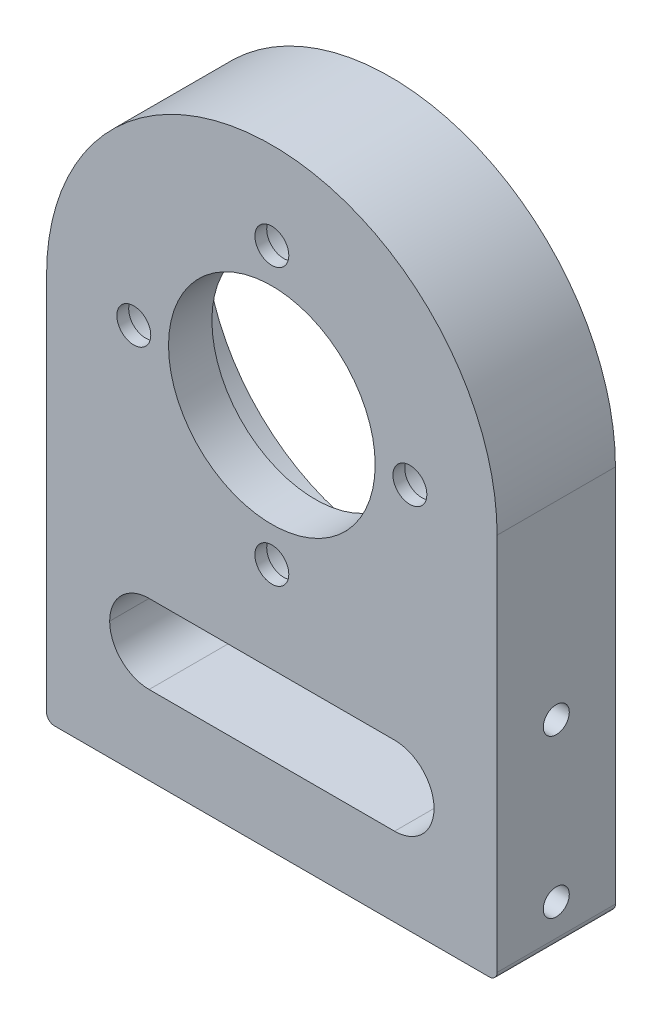
ISO-10303-21;
HEADER;
FILE_DESCRIPTION(('STEP AP214'),'2;1');
FILE_NAME('part.step','',(''),(''),'','','');
FILE_SCHEMA(('AUTOMOTIVE_DESIGN { 1 0 10303 214 1 1 1 1 }'));
ENDSEC;
DATA;
#1=APPLICATION_CONTEXT('core data for automotive mechanical design processes');
#2=APPLICATION_PROTOCOL_DEFINITION('international standard','automotive_design',2000,#1);
#3=PRODUCT_CONTEXT('',#1,'mechanical');
#4=PRODUCT('Part','Part','',(#3));
#5=PRODUCT_RELATED_PRODUCT_CATEGORY('part','',(#4));
#6=PRODUCT_DEFINITION_FORMATION('','',#4);
#7=PRODUCT_DEFINITION_CONTEXT('part definition',#1,'design');
#8=PRODUCT_DEFINITION('design','',#6,#7);
#9=PRODUCT_DEFINITION_SHAPE('','',#8);
#10=(LENGTH_UNIT() NAMED_UNIT(*) SI_UNIT(.MILLI.,.METRE.));
#11=(NAMED_UNIT(*) PLANE_ANGLE_UNIT() SI_UNIT($,.RADIAN.));
#12=(NAMED_UNIT(*) SI_UNIT($,.STERADIAN.) SOLID_ANGLE_UNIT());
#13=UNCERTAINTY_MEASURE_WITH_UNIT(LENGTH_MEASURE(1.E-05),#10,'distance_accuracy_value','');
#14=(GEOMETRIC_REPRESENTATION_CONTEXT(3) GLOBAL_UNCERTAINTY_ASSIGNED_CONTEXT((#13)) GLOBAL_UNIT_ASSIGNED_CONTEXT((#10,
#11,#12)) REPRESENTATION_CONTEXT('',''));
#15=CARTESIAN_POINT('',(0.,0.,0.));
#16=DIRECTION('',(0.,0.,1.));
#17=DIRECTION('',(1.,0.,0.));
#18=AXIS2_PLACEMENT_3D('',#15,#16,#17);
#19=CARTESIAN_POINT('',(0.,38.,15.));
#20=DIRECTION('',(0.,0.,1.));
#21=DIRECTION('',(1.,0.,0.));
#22=AXIS2_PLACEMENT_3D('',#19,#20,#21);
#23=PLANE('',#22);
#24=CARTESIAN_POINT('',(15.56,4.,15.));
#25=DIRECTION('',(0.,0.,1.));
#26=DIRECTION('',(1.,0.,0.));
#27=AXIS2_PLACEMENT_3D('',#24,#25,#26);
#28=CIRCLE('',#27,5.);
#29=CARTESIAN_POINT('',(15.56,8.99999999999999,15.));
#30=VERTEX_POINT('',#29);
#31=CARTESIAN_POINT('',(20.56,4.,15.));
#32=VERTEX_POINT('',#31);
#33=EDGE_CURVE('E58',#30,#32,#28,.F.);
#34=ORIENTED_EDGE('',*,*,#33,.T.);
#35=CARTESIAN_POINT('',(15.56,3.99999999999999,15.));
#36=DIRECTION('',(0.,0.,1.));
#37=DIRECTION('',(1.,0.,0.));
#38=AXIS2_PLACEMENT_3D('',#35,#36,#37);
#39=CIRCLE('',#38,5.);
#40=CARTESIAN_POINT('',(15.56,-1.00000000000001,15.));
#41=VERTEX_POINT('',#40);
#42=EDGE_CURVE('E11',#32,#41,#39,.F.);
#43=ORIENTED_EDGE('',*,*,#42,.T.);
#44=DIRECTION('',(-1.,0.,0.));
#45=VECTOR('',#44,1.);
#46=CARTESIAN_POINT('',(-20.56,-1.,15.));
#47=LINE('',#46,#45);
#48=CARTESIAN_POINT('',(-15.56,-1.,15.));
#49=VERTEX_POINT('',#48);
#50=EDGE_CURVE('E382',#41,#49,#47,.T.);
#51=ORIENTED_EDGE('',*,*,#50,.T.);
#52=CARTESIAN_POINT('',(-15.56,4.,15.));
#53=DIRECTION('',(0.,0.,1.));
#54=DIRECTION('',(1.,0.,0.));
#55=AXIS2_PLACEMENT_3D('',#52,#53,#54);
#56=CIRCLE('',#55,5.);
#57=CARTESIAN_POINT('',(-20.56,4.,15.));
#58=VERTEX_POINT('',#57);
#59=EDGE_CURVE('E353',#49,#58,#56,.F.);
#60=ORIENTED_EDGE('',*,*,#59,.T.);
#61=CARTESIAN_POINT('',(-15.56,4.,15.));
#62=DIRECTION('',(0.,0.,1.));
#63=DIRECTION('',(1.,0.,0.));
#64=AXIS2_PLACEMENT_3D('',#61,#62,#63);
#65=CIRCLE('',#64,5.);
#66=CARTESIAN_POINT('',(-15.56,9.,15.));
#67=VERTEX_POINT('',#66);
#68=EDGE_CURVE('E347',#58,#67,#65,.F.);
#69=ORIENTED_EDGE('',*,*,#68,.T.);
#70=DIRECTION('',(1.,0.,0.));
#71=VECTOR('',#70,1.);
#72=CARTESIAN_POINT('',(-20.56,9.,15.));
#73=LINE('',#72,#71);
#74=EDGE_CURVE('E163',#67,#30,#73,.T.);
#75=ORIENTED_EDGE('',*,*,#74,.T.);
#76=EDGE_LOOP('',(#34,#43,#51,#60,#69,#75));
#77=FACE_BOUND('',#76,.T.);
#78=CARTESIAN_POINT('',(0.,20.5,15.));
#79=DIRECTION('',(0.,0.,1.));
#80=DIRECTION('',(1.,0.,0.));
#81=AXIS2_PLACEMENT_3D('',#78,#79,#80);
#82=CIRCLE('',#81,2.15);
#83=CARTESIAN_POINT('',(2.15000000000003,20.5,15.));
#84=VERTEX_POINT('',#83);
#85=EDGE_CURVE('E261',#84,#84,#82,.T.);
#86=ORIENTED_EDGE('',*,*,#85,.F.);
#87=EDGE_LOOP('',(#86));
#88=FACE_BOUND('',#87,.T.);
#89=CARTESIAN_POINT('',(0.,55.5,15.));
#90=DIRECTION('',(0.,0.,1.));
#91=DIRECTION('',(1.,0.,0.));
#92=AXIS2_PLACEMENT_3D('',#89,#90,#91);
#93=CIRCLE('',#92,2.15);
#94=CARTESIAN_POINT('',(2.15000000000002,55.5,15.));
#95=VERTEX_POINT('',#94);
#96=EDGE_CURVE('E269',#95,#95,#93,.T.);
#97=ORIENTED_EDGE('',*,*,#96,.F.);
#98=EDGE_LOOP('',(#97));
#99=FACE_BOUND('',#98,.T.);
#100=CARTESIAN_POINT('',(0.,38.,15.));
#101=DIRECTION('',(0.,0.,1.));
#102=DIRECTION('',(1.,0.,0.));
#103=AXIS2_PLACEMENT_3D('',#100,#101,#102);
#104=CIRCLE('',#103,13.1);
#105=CARTESIAN_POINT('',(13.1,38.,15.));
#106=VERTEX_POINT('',#105);
#107=EDGE_CURVE('E273',#106,#106,#104,.T.);
#108=ORIENTED_EDGE('',*,*,#107,.F.);
#109=EDGE_LOOP('',(#108));
#110=FACE_BOUND('',#109,.T.);
#111=CARTESIAN_POINT('',(17.5,38.,15.));
#112=DIRECTION('',(0.,0.,1.));
#113=DIRECTION('',(1.,0.,0.));
#114=AXIS2_PLACEMENT_3D('',#111,#112,#113);
#115=CIRCLE('',#114,2.15);
#116=CARTESIAN_POINT('',(19.65,38.,15.));
#117=VERTEX_POINT('',#116);
#118=EDGE_CURVE('E265',#117,#117,#115,.T.);
#119=ORIENTED_EDGE('',*,*,#118,.F.);
#120=EDGE_LOOP('',(#119));
#121=FACE_BOUND('',#120,.T.);
#122=CARTESIAN_POINT('',(-17.5,38.,15.));
#123=DIRECTION('',(0.,0.,1.));
#124=DIRECTION('',(1.,0.,0.));
#125=AXIS2_PLACEMENT_3D('',#122,#123,#124);
#126=CIRCLE('',#125,2.15000000000009);
#127=CARTESIAN_POINT('',(-15.3499999999999,38.,15.));
#128=VERTEX_POINT('',#127);
#129=EDGE_CURVE('E246',#128,#128,#126,.T.);
#130=ORIENTED_EDGE('',*,*,#129,.F.);
#131=EDGE_LOOP('',(#130));
#132=FACE_BOUND('',#131,.T.);
#133=DIRECTION('',(0.,1.,0.));
#134=VECTOR('',#133,1.);
#135=CARTESIAN_POINT('',(28.56,-11.,15.));
#136=LINE('',#135,#134);
#137=CARTESIAN_POINT('',(28.56,-10.,15.));
#138=VERTEX_POINT('',#137);
#139=CARTESIAN_POINT('',(28.56,38.,15.));
#140=VERTEX_POINT('',#139);
#141=EDGE_CURVE('E159',#138,#140,#136,.T.);
#142=ORIENTED_EDGE('',*,*,#141,.T.);
#143=CARTESIAN_POINT('',(0.,38.,15.));
#144=DIRECTION('',(0.,0.,-1.));
#145=DIRECTION('',(-1.,0.,0.));
#146=AXIS2_PLACEMENT_3D('',#143,#144,#145);
#147=CIRCLE('',#146,28.56);
#148=CARTESIAN_POINT('',(-28.56,38.,15.));
#149=VERTEX_POINT('',#148);
#150=EDGE_CURVE('E151',#149,#140,#147,.T.);
#151=ORIENTED_EDGE('',*,*,#150,.F.);
#152=DIRECTION('',(0.,-1.,0.));
#153=VECTOR('',#152,1.);
#154=CARTESIAN_POINT('',(-28.56,-11.,15.));
#155=LINE('',#154,#153);
#156=CARTESIAN_POINT('',(-28.56,-10.,15.));
#157=VERTEX_POINT('',#156);
#158=EDGE_CURVE('E132',#149,#157,#155,.T.);
#159=ORIENTED_EDGE('',*,*,#158,.T.);
#160=CARTESIAN_POINT('',(-27.56,-10.,15.));
#161=DIRECTION('',(0.,0.,1.));
#162=DIRECTION('',(1.,0.,0.));
#163=AXIS2_PLACEMENT_3D('',#160,#161,#162);
#164=CIRCLE('',#163,1.);
#165=CARTESIAN_POINT('',(-27.56,-11.,15.));
#166=VERTEX_POINT('',#165);
#167=EDGE_CURVE('E308',#157,#166,#164,.T.);
#168=ORIENTED_EDGE('',*,*,#167,.T.);
#169=DIRECTION('',(1.,0.,0.));
#170=VECTOR('',#169,1.);
#171=CARTESIAN_POINT('',(-28.56,-11.,15.));
#172=LINE('',#171,#170);
#173=CARTESIAN_POINT('',(27.56,-11.,15.));
#174=VERTEX_POINT('',#173);
#175=EDGE_CURVE('E144',#166,#174,#172,.T.);
#176=ORIENTED_EDGE('',*,*,#175,.T.);
#177=CARTESIAN_POINT('',(27.56,-10.,15.));
#178=DIRECTION('',(0.,0.,1.));
#179=DIRECTION('',(1.,0.,0.));
#180=AXIS2_PLACEMENT_3D('',#177,#178,#179);
#181=CIRCLE('',#180,1.);
#182=EDGE_CURVE('E311',#174,#138,#181,.T.);
#183=ORIENTED_EDGE('',*,*,#182,.T.);
#184=EDGE_LOOP('',(#142,#151,#159,#168,#176,#183));
#185=FACE_BOUND('',#184,.T.);
#186=ADVANCED_FACE('F41',(#77,#88,#99,#110,#121,#132,#185),#23,.T.);
#187=CARTESIAN_POINT('',(0.,38.,0.));
#188=DIRECTION('',(0.,0.,1.));
#189=DIRECTION('',(1.,0.,0.));
#190=AXIS2_PLACEMENT_3D('',#187,#188,#189);
#191=PLANE('',#190);
#192=DIRECTION('',(-1.,0.,0.));
#193=VECTOR('',#192,1.);
#194=CARTESIAN_POINT('',(-20.56,-1.,0.));
#195=LINE('',#194,#193);
#196=CARTESIAN_POINT('',(15.56,-1.00000000000001,0.));
#197=VERTEX_POINT('',#196);
#198=CARTESIAN_POINT('',(-15.56,-1.,0.));
#199=VERTEX_POINT('',#198);
#200=EDGE_CURVE('E365',#197,#199,#195,.T.);
#201=ORIENTED_EDGE('',*,*,#200,.F.);
#202=CARTESIAN_POINT('',(15.56,3.99999999999999,0.));
#203=DIRECTION('',(0.,0.,1.));
#204=DIRECTION('',(1.,0.,0.));
#205=AXIS2_PLACEMENT_3D('',#202,#203,#204);
#206=CIRCLE('',#205,5.);
#207=CARTESIAN_POINT('',(20.56,4.,0.));
#208=VERTEX_POINT('',#207);
#209=EDGE_CURVE('E51',#197,#208,#206,.T.);
#210=ORIENTED_EDGE('',*,*,#209,.T.);
#211=CARTESIAN_POINT('',(15.56,4.,0.));
#212=DIRECTION('',(0.,0.,1.));
#213=DIRECTION('',(1.,0.,0.));
#214=AXIS2_PLACEMENT_3D('',#211,#212,#213);
#215=CIRCLE('',#214,5.);
#216=CARTESIAN_POINT('',(15.56,8.99999999999999,0.));
#217=VERTEX_POINT('',#216);
#218=EDGE_CURVE('E356',#208,#217,#215,.T.);
#219=ORIENTED_EDGE('',*,*,#218,.T.);
#220=DIRECTION('',(1.,0.,0.));
#221=VECTOR('',#220,1.);
#222=CARTESIAN_POINT('',(-20.56,9.,0.));
#223=LINE('',#222,#221);
#224=CARTESIAN_POINT('',(-15.56,9.,0.));
#225=VERTEX_POINT('',#224);
#226=EDGE_CURVE('E166',#225,#217,#223,.T.);
#227=ORIENTED_EDGE('',*,*,#226,.F.);
#228=CARTESIAN_POINT('',(-15.56,4.,0.));
#229=DIRECTION('',(0.,0.,1.));
#230=DIRECTION('',(1.,0.,0.));
#231=AXIS2_PLACEMENT_3D('',#228,#229,#230);
#232=CIRCLE('',#231,5.);
#233=CARTESIAN_POINT('',(-20.56,4.,0.));
#234=VERTEX_POINT('',#233);
#235=EDGE_CURVE('E344',#225,#234,#232,.T.);
#236=ORIENTED_EDGE('',*,*,#235,.T.);
#237=CARTESIAN_POINT('',(-15.56,4.,0.));
#238=DIRECTION('',(0.,0.,1.));
#239=DIRECTION('',(1.,0.,0.));
#240=AXIS2_PLACEMENT_3D('',#237,#238,#239);
#241=CIRCLE('',#240,5.);
#242=EDGE_CURVE('E350',#234,#199,#241,.T.);
#243=ORIENTED_EDGE('',*,*,#242,.T.);
#244=EDGE_LOOP('',(#201,#210,#219,#227,#236,#243));
#245=FACE_BOUND('',#244,.T.);
#246=CARTESIAN_POINT('',(0.,38.,0.));
#247=DIRECTION('',(0.,0.,-1.));
#248=DIRECTION('',(-1.,0.,0.));
#249=AXIS2_PLACEMENT_3D('',#246,#247,#248);
#250=CIRCLE('',#249,23.5);
#251=CARTESIAN_POINT('',(-23.5,38.,0.));
#252=VERTEX_POINT('',#251);
#253=EDGE_CURVE('E217',#252,#252,#250,.T.);
#254=ORIENTED_EDGE('',*,*,#253,.F.);
#255=EDGE_LOOP('',(#254));
#256=FACE_BOUND('',#255,.T.);
#257=CARTESIAN_POINT('',(0.,38.,0.));
#258=DIRECTION('',(0.,0.,-1.));
#259=DIRECTION('',(-1.,0.,0.));
#260=AXIS2_PLACEMENT_3D('',#257,#258,#259);
#261=CIRCLE('',#260,28.56);
#262=CARTESIAN_POINT('',(-28.56,38.,0.));
#263=VERTEX_POINT('',#262);
#264=CARTESIAN_POINT('',(28.56,38.,0.));
#265=VERTEX_POINT('',#264);
#266=EDGE_CURVE('E154',#263,#265,#261,.T.);
#267=ORIENTED_EDGE('',*,*,#266,.T.);
#268=DIRECTION('',(0.,1.,0.));
#269=VECTOR('',#268,1.);
#270=CARTESIAN_POINT('',(28.56,-11.,0.));
#271=LINE('',#270,#269);
#272=CARTESIAN_POINT('',(28.56,-10.,0.));
#273=VERTEX_POINT('',#272);
#274=EDGE_CURVE('E145',#273,#265,#271,.T.);
#275=ORIENTED_EDGE('',*,*,#274,.F.);
#276=CARTESIAN_POINT('',(27.56,-10.,0.));
#277=DIRECTION('',(0.,0.,1.));
#278=DIRECTION('',(1.,0.,0.));
#279=AXIS2_PLACEMENT_3D('',#276,#277,#278);
#280=CIRCLE('',#279,1.);
#281=CARTESIAN_POINT('',(27.56,-11.,0.));
#282=VERTEX_POINT('',#281);
#283=EDGE_CURVE('E298',#273,#282,#280,.F.);
#284=ORIENTED_EDGE('',*,*,#283,.T.);
#285=DIRECTION('',(1.,0.,0.));
#286=VECTOR('',#285,1.);
#287=CARTESIAN_POINT('',(-28.56,-11.,0.));
#288=LINE('',#287,#286);
#289=CARTESIAN_POINT('',(-27.56,-11.,0.));
#290=VERTEX_POINT('',#289);
#291=EDGE_CURVE('E286',#290,#282,#288,.T.);
#292=ORIENTED_EDGE('',*,*,#291,.F.);
#293=CARTESIAN_POINT('',(-27.56,-10.,0.));
#294=DIRECTION('',(0.,0.,1.));
#295=DIRECTION('',(1.,0.,0.));
#296=AXIS2_PLACEMENT_3D('',#293,#294,#295);
#297=CIRCLE('',#296,1.);
#298=CARTESIAN_POINT('',(-28.56,-10.,0.));
#299=VERTEX_POINT('',#298);
#300=EDGE_CURVE('E295',#290,#299,#297,.F.);
#301=ORIENTED_EDGE('',*,*,#300,.T.);
#302=DIRECTION('',(0.,-1.,0.));
#303=VECTOR('',#302,1.);
#304=CARTESIAN_POINT('',(-28.56,-11.,0.));
#305=LINE('',#304,#303);
#306=EDGE_CURVE('E276',#263,#299,#305,.T.);
#307=ORIENTED_EDGE('',*,*,#306,.F.);
#308=EDGE_LOOP('',(#267,#275,#284,#292,#301,#307));
#309=FACE_BOUND('',#308,.T.);
#310=ADVANCED_FACE('F398',(#245,#256,#309),#191,.F.);
#311=CARTESIAN_POINT('',(0.,55.5,15.));
#312=DIRECTION('',(0.,0.,-1.));
#313=DIRECTION('',(-1.,0.,0.));
#314=AXIS2_PLACEMENT_3D('',#311,#312,#313);
#315=CYLINDRICAL_SURFACE('',#314,2.15);
#316=ORIENTED_EDGE('',*,*,#96,.T.);
#317=EDGE_LOOP('',(#316));
#318=FACE_BOUND('',#317,.T.);
#319=CARTESIAN_POINT('',(0.,55.5,13.5));
#320=DIRECTION('',(0.,0.,-1.));
#321=DIRECTION('',(-1.,0.,0.));
#322=AXIS2_PLACEMENT_3D('',#319,#320,#321);
#323=CIRCLE('',#322,2.15);
#324=CARTESIAN_POINT('',(-2.14999999999998,55.5,13.5));
#325=VERTEX_POINT('',#324);
#326=EDGE_CURVE('E213',#325,#325,#323,.T.);
#327=ORIENTED_EDGE('',*,*,#326,.T.);
#328=EDGE_LOOP('',(#327));
#329=FACE_BOUND('',#328,.T.);
#330=ADVANCED_FACE('F417',(#318,#329),#315,.F.);
#331=CARTESIAN_POINT('',(17.5,38.,15.));
#332=DIRECTION('',(0.,0.,-1.));
#333=DIRECTION('',(-1.,0.,0.));
#334=AXIS2_PLACEMENT_3D('',#331,#332,#333);
#335=CYLINDRICAL_SURFACE('',#334,2.15);
#336=ORIENTED_EDGE('',*,*,#118,.T.);
#337=EDGE_LOOP('',(#336));
#338=FACE_BOUND('',#337,.T.);
#339=CARTESIAN_POINT('',(17.5,38.,13.5));
#340=DIRECTION('',(0.,0.,-1.));
#341=DIRECTION('',(-1.,0.,0.));
#342=AXIS2_PLACEMENT_3D('',#339,#340,#341);
#343=CIRCLE('',#342,2.15);
#344=CARTESIAN_POINT('',(15.35,38.,13.5));
#345=VERTEX_POINT('',#344);
#346=EDGE_CURVE('E324',#345,#345,#343,.T.);
#347=ORIENTED_EDGE('',*,*,#346,.T.);
#348=EDGE_LOOP('',(#347));
#349=FACE_BOUND('',#348,.T.);
#350=ADVANCED_FACE('F505',(#338,#349),#335,.F.);
#351=CARTESIAN_POINT('',(0.,20.5,15.));
#352=DIRECTION('',(0.,0.,-1.));
#353=DIRECTION('',(-1.,0.,0.));
#354=AXIS2_PLACEMENT_3D('',#351,#352,#353);
#355=CYLINDRICAL_SURFACE('',#354,2.15);
#356=ORIENTED_EDGE('',*,*,#85,.T.);
#357=EDGE_LOOP('',(#356));
#358=FACE_BOUND('',#357,.T.);
#359=CARTESIAN_POINT('',(0.,20.5,13.5));
#360=DIRECTION('',(0.,0.,-1.));
#361=DIRECTION('',(-1.,0.,0.));
#362=AXIS2_PLACEMENT_3D('',#359,#360,#361);
#363=CIRCLE('',#362,2.15);
#364=CARTESIAN_POINT('',(-2.14999999999996,20.5,13.5));
#365=VERTEX_POINT('',#364);
#366=EDGE_CURVE('E320',#365,#365,#363,.T.);
#367=ORIENTED_EDGE('',*,*,#366,.T.);
#368=EDGE_LOOP('',(#367));
#369=FACE_BOUND('',#368,.T.);
#370=ADVANCED_FACE('F501',(#358,#369),#355,.F.);
#371=CARTESIAN_POINT('',(-17.5,38.,15.));
#372=DIRECTION('',(0.,0.,-1.));
#373=DIRECTION('',(-1.,0.,0.));
#374=AXIS2_PLACEMENT_3D('',#371,#372,#373);
#375=CYLINDRICAL_SURFACE('',#374,2.15000000000009);
#376=ORIENTED_EDGE('',*,*,#129,.T.);
#377=EDGE_LOOP('',(#376));
#378=FACE_BOUND('',#377,.T.);
#379=CARTESIAN_POINT('',(-17.5,38.,13.5));
#380=DIRECTION('',(0.,0.,-1.));
#381=DIRECTION('',(-1.,0.,0.));
#382=AXIS2_PLACEMENT_3D('',#379,#380,#381);
#383=CIRCLE('',#382,2.15000000000009);
#384=CARTESIAN_POINT('',(-19.6500000000001,38.,13.5));
#385=VERTEX_POINT('',#384);
#386=EDGE_CURVE('E176',#385,#385,#383,.T.);
#387=ORIENTED_EDGE('',*,*,#386,.T.);
#388=EDGE_LOOP('',(#387));
#389=FACE_BOUND('',#388,.T.);
#390=ADVANCED_FACE('F498',(#378,#389),#375,.F.);
#391=CARTESIAN_POINT('',(0.,38.,15.));
#392=DIRECTION('',(0.,0.,-1.));
#393=DIRECTION('',(-1.,0.,0.));
#394=AXIS2_PLACEMENT_3D('',#391,#392,#393);
#395=CYLINDRICAL_SURFACE('',#394,13.1);
#396=ORIENTED_EDGE('',*,*,#107,.T.);
#397=EDGE_LOOP('',(#396));
#398=FACE_BOUND('',#397,.T.);
#399=CARTESIAN_POINT('',(0.,38.,9.5));
#400=DIRECTION('',(0.,0.,-1.));
#401=DIRECTION('',(-1.,0.,0.));
#402=AXIS2_PLACEMENT_3D('',#399,#400,#401);
#403=CIRCLE('',#402,13.1);
#404=CARTESIAN_POINT('',(-13.1,38.,9.5));
#405=VERTEX_POINT('',#404);
#406=EDGE_CURVE('E208',#405,#405,#403,.T.);
#407=ORIENTED_EDGE('',*,*,#406,.T.);
#408=EDGE_LOOP('',(#407));
#409=FACE_BOUND('',#408,.T.);
#410=ADVANCED_FACE('F420',(#398,#409),#395,.F.);
#411=CARTESIAN_POINT('',(-28.56,-11.,15.));
#412=DIRECTION('',(1.,0.,0.));
#413=DIRECTION('',(0.,0.,-1.));
#414=AXIS2_PLACEMENT_3D('',#411,#412,#413);
#415=PLANE('',#414);
#416=CARTESIAN_POINT('',(-28.56,-5.99999999999999,7.5));
#417=DIRECTION('',(1.,0.,0.));
#418=DIRECTION('',(0.,0.,-1.));
#419=AXIS2_PLACEMENT_3D('',#416,#417,#418);
#420=CIRCLE('',#419,1.65);
#421=CARTESIAN_POINT('',(-28.56,-5.99999999999999,5.85));
#422=VERTEX_POINT('',#421);
#423=EDGE_CURVE('E231',#422,#422,#420,.T.);
#424=ORIENTED_EDGE('',*,*,#423,.T.);
#425=EDGE_LOOP('',(#424));
#426=FACE_BOUND('',#425,.T.);
#427=CARTESIAN_POINT('',(-28.56,14.,7.5));
#428=DIRECTION('',(1.,0.,0.));
#429=DIRECTION('',(0.,0.,-1.));
#430=AXIS2_PLACEMENT_3D('',#427,#428,#429);
#431=CIRCLE('',#430,1.65);
#432=CARTESIAN_POINT('',(-28.56,14.,5.85));
#433=VERTEX_POINT('',#432);
#434=EDGE_CURVE('E222',#433,#433,#431,.T.);
#435=ORIENTED_EDGE('',*,*,#434,.T.);
#436=EDGE_LOOP('',(#435));
#437=FACE_BOUND('',#436,.T.);
#438=ORIENTED_EDGE('',*,*,#306,.T.);
#439=DIRECTION('',(0.,0.,-1.));
#440=VECTOR('',#439,1.);
#441=CARTESIAN_POINT('',(-28.56,-10.,15.));
#442=LINE('',#441,#440);
#443=EDGE_CURVE('E139',#299,#157,#442,.F.);
#444=ORIENTED_EDGE('',*,*,#443,.T.);
#445=ORIENTED_EDGE('',*,*,#158,.F.);
#446=DIRECTION('',(0.,0.,-1.));
#447=VECTOR('',#446,1.);
#448=CARTESIAN_POINT('',(-28.56,38.,15.));
#449=LINE('',#448,#447);
#450=EDGE_CURVE('E136',#149,#263,#449,.T.);
#451=ORIENTED_EDGE('',*,*,#450,.T.);
#452=EDGE_LOOP('',(#438,#444,#445,#451));
#453=FACE_BOUND('',#452,.T.);
#454=ADVANCED_FACE('F135',(#426,#437,#453),#415,.F.);
#455=CARTESIAN_POINT('',(-28.56,-11.,15.));
#456=DIRECTION('',(0.,1.,0.));
#457=DIRECTION('',(0.,0.,1.));
#458=AXIS2_PLACEMENT_3D('',#455,#456,#457);
#459=PLANE('',#458);
#460=ORIENTED_EDGE('',*,*,#291,.T.);
#461=DIRECTION('',(0.,0.,-1.));
#462=VECTOR('',#461,1.);
#463=CARTESIAN_POINT('',(27.56,-11.,15.));
#464=LINE('',#463,#462);
#465=EDGE_CURVE('E305',#282,#174,#464,.F.);
#466=ORIENTED_EDGE('',*,*,#465,.T.);
#467=ORIENTED_EDGE('',*,*,#175,.F.);
#468=DIRECTION('',(0.,0.,-1.));
#469=VECTOR('',#468,1.);
#470=CARTESIAN_POINT('',(-27.56,-11.,15.));
#471=LINE('',#470,#469);
#472=EDGE_CURVE('E301',#166,#290,#471,.T.);
#473=ORIENTED_EDGE('',*,*,#472,.T.);
#474=EDGE_LOOP('',(#460,#466,#467,#473));
#475=FACE_BOUND('',#474,.T.);
#476=ADVANCED_FACE('F427',(#475),#459,.F.);
#477=CARTESIAN_POINT('',(28.56,-11.,15.));
#478=DIRECTION('',(-1.,0.,0.));
#479=DIRECTION('',(0.,-1.,0.));
#480=AXIS2_PLACEMENT_3D('',#477,#478,#479);
#481=PLANE('',#480);
#482=CARTESIAN_POINT('',(28.56,-5.99999999999999,7.5));
#483=DIRECTION('',(1.,0.,0.));
#484=DIRECTION('',(0.,0.,-1.));
#485=AXIS2_PLACEMENT_3D('',#482,#483,#484);
#486=CIRCLE('',#485,1.65);
#487=CARTESIAN_POINT('',(28.56,-5.99999999999999,5.85));
#488=VERTEX_POINT('',#487);
#489=EDGE_CURVE('E247',#488,#488,#486,.T.);
#490=ORIENTED_EDGE('',*,*,#489,.F.);
#491=EDGE_LOOP('',(#490));
#492=FACE_BOUND('',#491,.T.);
#493=CARTESIAN_POINT('',(28.56,14.,7.5));
#494=DIRECTION('',(1.,0.,0.));
#495=DIRECTION('',(0.,0.,-1.));
#496=AXIS2_PLACEMENT_3D('',#493,#494,#495);
#497=CIRCLE('',#496,1.65);
#498=CARTESIAN_POINT('',(28.56,14.,5.85));
#499=VERTEX_POINT('',#498);
#500=EDGE_CURVE('E230',#499,#499,#497,.T.);
#501=ORIENTED_EDGE('',*,*,#500,.F.);
#502=EDGE_LOOP('',(#501));
#503=FACE_BOUND('',#502,.T.);
#504=ORIENTED_EDGE('',*,*,#141,.F.);
#505=DIRECTION('',(0.,0.,-1.));
#506=VECTOR('',#505,1.);
#507=CARTESIAN_POINT('',(28.56,-10.,15.));
#508=LINE('',#507,#506);
#509=EDGE_CURVE('E283',#138,#273,#508,.T.);
#510=ORIENTED_EDGE('',*,*,#509,.T.);
#511=ORIENTED_EDGE('',*,*,#274,.T.);
#512=DIRECTION('',(0.,0.,-1.));
#513=VECTOR('',#512,1.);
#514=CARTESIAN_POINT('',(28.56,38.,15.));
#515=LINE('',#514,#513);
#516=EDGE_CURVE('E156',#140,#265,#515,.T.);
#517=ORIENTED_EDGE('',*,*,#516,.F.);
#518=EDGE_LOOP('',(#504,#510,#511,#517));
#519=FACE_BOUND('',#518,.T.);
#520=ADVANCED_FACE('F423',(#492,#503,#519),#481,.F.);
#521=CARTESIAN_POINT('',(18.56,14.,7.5));
#522=DIRECTION('',(1.,0.,0.));
#523=DIRECTION('',(0.,0.,-1.));
#524=AXIS2_PLACEMENT_3D('',#521,#522,#523);
#525=CYLINDRICAL_SURFACE('',#524,1.65);
#526=CARTESIAN_POINT('',(18.56,14.,7.5));
#527=DIRECTION('',(1.,0.,0.));
#528=DIRECTION('',(0.,0.,-1.));
#529=AXIS2_PLACEMENT_3D('',#526,#527,#528);
#530=CIRCLE('',#529,1.65);
#531=CARTESIAN_POINT('',(18.56,14.,5.85));
#532=VERTEX_POINT('',#531);
#533=EDGE_CURVE('E251',#532,#532,#530,.T.);
#534=ORIENTED_EDGE('',*,*,#533,.F.);
#535=EDGE_LOOP('',(#534));
#536=FACE_BOUND('',#535,.T.);
#537=ORIENTED_EDGE('',*,*,#500,.T.);
#538=EDGE_LOOP('',(#537));
#539=FACE_BOUND('',#538,.T.);
#540=ADVANCED_FACE('F426',(#536,#539),#525,.F.);
#541=CARTESIAN_POINT('',(18.56,14.,7.5));
#542=DIRECTION('',(1.,0.,0.));
#543=DIRECTION('',(0.,0.,-1.));
#544=AXIS2_PLACEMENT_3D('',#541,#542,#543);
#545=PLANE('',#544);
#546=ORIENTED_EDGE('',*,*,#533,.T.);
#547=EDGE_LOOP('',(#546));
#548=FACE_BOUND('',#547,.T.);
#549=ADVANCED_FACE('F490',(#548),#545,.T.);
#550=CARTESIAN_POINT('',(18.56,-5.99999999999999,7.5));
#551=DIRECTION('',(1.,0.,0.));
#552=DIRECTION('',(0.,0.,-1.));
#553=AXIS2_PLACEMENT_3D('',#550,#551,#552);
#554=CYLINDRICAL_SURFACE('',#553,1.65);
#555=CARTESIAN_POINT('',(18.56,-5.99999999999999,7.5));
#556=DIRECTION('',(1.,0.,0.));
#557=DIRECTION('',(0.,0.,-1.));
#558=AXIS2_PLACEMENT_3D('',#555,#556,#557);
#559=CIRCLE('',#558,1.65);
#560=CARTESIAN_POINT('',(18.56,-5.99999999999999,5.85));
#561=VERTEX_POINT('',#560);
#562=EDGE_CURVE('E242',#561,#561,#559,.T.);
#563=ORIENTED_EDGE('',*,*,#562,.F.);
#564=EDGE_LOOP('',(#563));
#565=FACE_BOUND('',#564,.T.);
#566=ORIENTED_EDGE('',*,*,#489,.T.);
#567=EDGE_LOOP('',(#566));
#568=FACE_BOUND('',#567,.T.);
#569=ADVANCED_FACE('F486',(#565,#568),#554,.F.);
#570=CARTESIAN_POINT('',(18.56,-5.99999999999999,7.5));
#571=DIRECTION('',(1.,0.,0.));
#572=DIRECTION('',(0.,0.,-1.));
#573=AXIS2_PLACEMENT_3D('',#570,#571,#572);
#574=PLANE('',#573);
#575=ORIENTED_EDGE('',*,*,#562,.T.);
#576=EDGE_LOOP('',(#575));
#577=FACE_BOUND('',#576,.T.);
#578=ADVANCED_FACE('F482',(#577),#574,.T.);
#579=CARTESIAN_POINT('',(-18.56,14.,7.5));
#580=DIRECTION('',(-1.,0.,0.));
#581=DIRECTION('',(0.,0.,1.));
#582=AXIS2_PLACEMENT_3D('',#579,#580,#581);
#583=CYLINDRICAL_SURFACE('',#582,1.65);
#584=CARTESIAN_POINT('',(-18.56,14.,7.5));
#585=DIRECTION('',(1.,0.,0.));
#586=DIRECTION('',(0.,0.,-1.));
#587=AXIS2_PLACEMENT_3D('',#584,#585,#586);
#588=CIRCLE('',#587,1.65);
#589=CARTESIAN_POINT('',(-18.56,14.,5.85));
#590=VERTEX_POINT('',#589);
#591=EDGE_CURVE('E235',#590,#590,#588,.T.);
#592=ORIENTED_EDGE('',*,*,#591,.T.);
#593=EDGE_LOOP('',(#592));
#594=FACE_BOUND('',#593,.T.);
#595=ORIENTED_EDGE('',*,*,#434,.F.);
#596=EDGE_LOOP('',(#595));
#597=FACE_BOUND('',#596,.T.);
#598=ADVANCED_FACE('F478',(#594,#597),#583,.F.);
#599=CARTESIAN_POINT('',(-18.56,14.,7.5));
#600=DIRECTION('',(-1.,0.,0.));
#601=DIRECTION('',(0.,0.,-1.));
#602=AXIS2_PLACEMENT_3D('',#599,#600,#601);
#603=PLANE('',#602);
#604=ORIENTED_EDGE('',*,*,#591,.F.);
#605=EDGE_LOOP('',(#604));
#606=FACE_BOUND('',#605,.T.);
#607=ADVANCED_FACE('F474',(#606),#603,.T.);
#608=CARTESIAN_POINT('',(-18.56,-5.99999999999999,7.5));
#609=DIRECTION('',(-1.,0.,0.));
#610=DIRECTION('',(0.,0.,1.));
#611=AXIS2_PLACEMENT_3D('',#608,#609,#610);
#612=CYLINDRICAL_SURFACE('',#611,1.65);
#613=CARTESIAN_POINT('',(-18.56,-5.99999999999999,7.5));
#614=DIRECTION('',(1.,0.,0.));
#615=DIRECTION('',(0.,0.,-1.));
#616=AXIS2_PLACEMENT_3D('',#613,#614,#615);
#617=CIRCLE('',#616,1.65);
#618=CARTESIAN_POINT('',(-18.56,-5.99999999999999,5.85));
#619=VERTEX_POINT('',#618);
#620=EDGE_CURVE('E226',#619,#619,#617,.T.);
#621=ORIENTED_EDGE('',*,*,#620,.T.);
#622=EDGE_LOOP('',(#621));
#623=FACE_BOUND('',#622,.T.);
#624=ORIENTED_EDGE('',*,*,#423,.F.);
#625=EDGE_LOOP('',(#624));
#626=FACE_BOUND('',#625,.T.);
#627=ADVANCED_FACE('F470',(#623,#626),#612,.F.);
#628=CARTESIAN_POINT('',(-18.56,-5.99999999999999,7.5));
#629=DIRECTION('',(-1.,0.,0.));
#630=DIRECTION('',(0.,0.,-1.));
#631=AXIS2_PLACEMENT_3D('',#628,#629,#630);
#632=PLANE('',#631);
#633=ORIENTED_EDGE('',*,*,#620,.F.);
#634=EDGE_LOOP('',(#633));
#635=FACE_BOUND('',#634,.T.);
#636=ADVANCED_FACE('F438',(#635),#632,.T.);
#637=CARTESIAN_POINT('',(27.56,-10.,15.));
#638=DIRECTION('',(0.,0.,-1.));
#639=DIRECTION('',(-1.,0.,0.));
#640=AXIS2_PLACEMENT_3D('',#637,#638,#639);
#641=CYLINDRICAL_SURFACE('',#640,1.);
#642=ORIENTED_EDGE('',*,*,#182,.F.);
#643=ORIENTED_EDGE('',*,*,#465,.F.);
#644=ORIENTED_EDGE('',*,*,#283,.F.);
#645=ORIENTED_EDGE('',*,*,#509,.F.);
#646=EDGE_LOOP('',(#642,#643,#644,#645));
#647=FACE_BOUND('',#646,.T.);
#648=ADVANCED_FACE('F435',(#647),#641,.T.);
#649=CARTESIAN_POINT('',(-27.56,-10.,15.));
#650=DIRECTION('',(0.,0.,-1.));
#651=DIRECTION('',(-1.,0.,0.));
#652=AXIS2_PLACEMENT_3D('',#649,#650,#651);
#653=CYLINDRICAL_SURFACE('',#652,1.);
#654=ORIENTED_EDGE('',*,*,#167,.F.);
#655=ORIENTED_EDGE('',*,*,#443,.F.);
#656=ORIENTED_EDGE('',*,*,#300,.F.);
#657=ORIENTED_EDGE('',*,*,#472,.F.);
#658=EDGE_LOOP('',(#654,#655,#656,#657));
#659=FACE_BOUND('',#658,.T.);
#660=ADVANCED_FACE('F437',(#659),#653,.T.);
#661=CARTESIAN_POINT('',(0.,38.,9.));
#662=DIRECTION('',(0.,0.,-1.));
#663=DIRECTION('',(-1.,0.,0.));
#664=AXIS2_PLACEMENT_3D('',#661,#662,#663);
#665=CYLINDRICAL_SURFACE('',#664,23.5);
#666=CARTESIAN_POINT('',(0.,38.,9.));
#667=DIRECTION('',(0.,0.,-1.));
#668=DIRECTION('',(-1.,0.,0.));
#669=AXIS2_PLACEMENT_3D('',#666,#667,#668);
#670=CIRCLE('',#669,23.5);
#671=CARTESIAN_POINT('',(-23.5,38.,9.));
#672=VERTEX_POINT('',#671);
#673=EDGE_CURVE('E218',#672,#672,#670,.T.);
#674=ORIENTED_EDGE('',*,*,#673,.F.);
#675=EDGE_LOOP('',(#674));
#676=FACE_BOUND('',#675,.T.);
#677=ORIENTED_EDGE('',*,*,#253,.T.);
#678=EDGE_LOOP('',(#677));
#679=FACE_BOUND('',#678,.T.);
#680=ADVANCED_FACE('F441',(#676,#679),#665,.F.);
#681=CARTESIAN_POINT('',(0.,38.,9.));
#682=DIRECTION('',(0.,0.,-1.));
#683=DIRECTION('',(-1.,0.,0.));
#684=AXIS2_PLACEMENT_3D('',#681,#682,#683);
#685=PLANE('',#684);
#686=CARTESIAN_POINT('',(0.,38.,9.));
#687=DIRECTION('',(0.,0.,-1.));
#688=DIRECTION('',(-1.,0.,0.));
#689=AXIS2_PLACEMENT_3D('',#686,#687,#688);
#690=CIRCLE('',#689,22.5);
#691=CARTESIAN_POINT('',(-22.5,38.,9.));
#692=VERTEX_POINT('',#691);
#693=EDGE_CURVE('E209',#692,#692,#690,.T.);
#694=ORIENTED_EDGE('',*,*,#693,.F.);
#695=EDGE_LOOP('',(#694));
#696=FACE_BOUND('',#695,.T.);
#697=ORIENTED_EDGE('',*,*,#673,.T.);
#698=EDGE_LOOP('',(#697));
#699=FACE_BOUND('',#698,.T.);
#700=ADVANCED_FACE('F446',(#696,#699),#685,.T.);
#701=CARTESIAN_POINT('',(0.,38.,9.5));
#702=DIRECTION('',(0.,0.,-1.));
#703=DIRECTION('',(-1.,0.,0.));
#704=AXIS2_PLACEMENT_3D('',#701,#702,#703);
#705=CYLINDRICAL_SURFACE('',#704,22.5);
#706=CARTESIAN_POINT('',(0.,38.,9.5));
#707=DIRECTION('',(0.,0.,-1.));
#708=DIRECTION('',(-1.,0.,0.));
#709=AXIS2_PLACEMENT_3D('',#706,#707,#708);
#710=CIRCLE('',#709,22.5);
#711=CARTESIAN_POINT('',(-22.5,38.,9.5));
#712=VERTEX_POINT('',#711);
#713=EDGE_CURVE('E204',#712,#712,#710,.T.);
#714=ORIENTED_EDGE('',*,*,#713,.F.);
#715=EDGE_LOOP('',(#714));
#716=FACE_BOUND('',#715,.T.);
#717=ORIENTED_EDGE('',*,*,#693,.T.);
#718=EDGE_LOOP('',(#717));
#719=FACE_BOUND('',#718,.T.);
#720=ADVANCED_FACE('F461',(#716,#719),#705,.F.);
#721=CARTESIAN_POINT('',(0.,38.,9.5));
#722=DIRECTION('',(0.,0.,-1.));
#723=DIRECTION('',(-1.,0.,0.));
#724=AXIS2_PLACEMENT_3D('',#721,#722,#723);
#725=PLANE('',#724);
#726=CARTESIAN_POINT('',(0.,55.5,9.5));
#727=DIRECTION('',(0.,0.,-1.));
#728=DIRECTION('',(-1.,0.,0.));
#729=AXIS2_PLACEMENT_3D('',#726,#727,#728);
#730=CIRCLE('',#729,4.00000000000001);
#731=CARTESIAN_POINT('',(-3.99999999999999,55.5,9.5));
#732=VERTEX_POINT('',#731);
#733=EDGE_CURVE('E177',#732,#732,#730,.T.);
#734=ORIENTED_EDGE('',*,*,#733,.F.);
#735=EDGE_LOOP('',(#734));
#736=FACE_BOUND('',#735,.T.);
#737=CARTESIAN_POINT('',(-17.5,38.,9.5));
#738=DIRECTION('',(0.,0.,-1.));
#739=DIRECTION('',(-1.,0.,0.));
#740=AXIS2_PLACEMENT_3D('',#737,#738,#739);
#741=CIRCLE('',#740,4.);
#742=CARTESIAN_POINT('',(-21.5,38.,9.5));
#743=VERTEX_POINT('',#742);
#744=EDGE_CURVE('E185',#743,#743,#741,.T.);
#745=ORIENTED_EDGE('',*,*,#744,.F.);
#746=EDGE_LOOP('',(#745));
#747=FACE_BOUND('',#746,.T.);
#748=CARTESIAN_POINT('',(17.5,38.,9.5));
#749=DIRECTION('',(0.,0.,-1.));
#750=DIRECTION('',(-1.,0.,0.));
#751=AXIS2_PLACEMENT_3D('',#748,#749,#750);
#752=CIRCLE('',#751,4.);
#753=CARTESIAN_POINT('',(13.5,38.,9.5));
#754=VERTEX_POINT('',#753);
#755=EDGE_CURVE('E193',#754,#754,#752,.T.);
#756=ORIENTED_EDGE('',*,*,#755,.F.);
#757=EDGE_LOOP('',(#756));
#758=FACE_BOUND('',#757,.T.);
#759=CARTESIAN_POINT('',(0.,20.5,9.5));
#760=DIRECTION('',(0.,0.,-1.));
#761=DIRECTION('',(-1.,0.,0.));
#762=AXIS2_PLACEMENT_3D('',#759,#760,#761);
#763=CIRCLE('',#762,4.00000000000001);
#764=CARTESIAN_POINT('',(-3.99999999999997,20.5,9.5));
#765=VERTEX_POINT('',#764);
#766=EDGE_CURVE('E170',#765,#765,#763,.T.);
#767=ORIENTED_EDGE('',*,*,#766,.F.);
#768=EDGE_LOOP('',(#767));
#769=FACE_BOUND('',#768,.T.);
#770=ORIENTED_EDGE('',*,*,#406,.F.);
#771=EDGE_LOOP('',(#770));
#772=FACE_BOUND('',#771,.T.);
#773=ORIENTED_EDGE('',*,*,#713,.T.);
#774=EDGE_LOOP('',(#773));
#775=FACE_BOUND('',#774,.T.);
#776=ADVANCED_FACE('F530',(#736,#747,#758,#769,#772,#775),#725,.T.);
#777=CARTESIAN_POINT('',(0.,20.5,13.5));
#778=DIRECTION('',(0.,0.,-1.));
#779=DIRECTION('',(-1.,0.,0.));
#780=AXIS2_PLACEMENT_3D('',#777,#778,#779);
#781=CYLINDRICAL_SURFACE('',#780,4.00000000000001);
#782=CARTESIAN_POINT('',(0.,20.5,13.5));
#783=DIRECTION('',(0.,0.,-1.));
#784=DIRECTION('',(-1.,0.,0.));
#785=AXIS2_PLACEMENT_3D('',#782,#783,#784);
#786=CIRCLE('',#785,4.00000000000001);
#787=CARTESIAN_POINT('',(-3.99999999999997,20.5,13.5));
#788=VERTEX_POINT('',#787);
#789=EDGE_CURVE('E197',#788,#788,#786,.T.);
#790=ORIENTED_EDGE('',*,*,#789,.F.);
#791=EDGE_LOOP('',(#790));
#792=FACE_BOUND('',#791,.T.);
#793=ORIENTED_EDGE('',*,*,#766,.T.);
#794=EDGE_LOOP('',(#793));
#795=FACE_BOUND('',#794,.T.);
#796=ADVANCED_FACE('F533',(#792,#795),#781,.F.);
#797=CARTESIAN_POINT('',(0.,20.5,13.5));
#798=DIRECTION('',(0.,0.,-1.));
#799=DIRECTION('',(-1.,0.,0.));
#800=AXIS2_PLACEMENT_3D('',#797,#798,#799);
#801=PLANE('',#800);
#802=ORIENTED_EDGE('',*,*,#366,.F.);
#803=EDGE_LOOP('',(#802));
#804=FACE_BOUND('',#803,.T.);
#805=ORIENTED_EDGE('',*,*,#789,.T.);
#806=EDGE_LOOP('',(#805));
#807=FACE_BOUND('',#806,.T.);
#808=ADVANCED_FACE('F554',(#804,#807),#801,.T.);
#809=CARTESIAN_POINT('',(17.5,38.,13.5));
#810=DIRECTION('',(0.,0.,-1.));
#811=DIRECTION('',(-1.,0.,0.));
#812=AXIS2_PLACEMENT_3D('',#809,#810,#811);
#813=CYLINDRICAL_SURFACE('',#812,4.);
#814=CARTESIAN_POINT('',(17.5,38.,13.5));
#815=DIRECTION('',(0.,0.,-1.));
#816=DIRECTION('',(-1.,0.,0.));
#817=AXIS2_PLACEMENT_3D('',#814,#815,#816);
#818=CIRCLE('',#817,4.);
#819=CARTESIAN_POINT('',(13.5,38.,13.5));
#820=VERTEX_POINT('',#819);
#821=EDGE_CURVE('E189',#820,#820,#818,.T.);
#822=ORIENTED_EDGE('',*,*,#821,.F.);
#823=EDGE_LOOP('',(#822));
#824=FACE_BOUND('',#823,.T.);
#825=ORIENTED_EDGE('',*,*,#755,.T.);
#826=EDGE_LOOP('',(#825));
#827=FACE_BOUND('',#826,.T.);
#828=ADVANCED_FACE('F558',(#824,#827),#813,.F.);
#829=CARTESIAN_POINT('',(17.5,38.,13.5));
#830=DIRECTION('',(0.,0.,-1.));
#831=DIRECTION('',(-1.,0.,0.));
#832=AXIS2_PLACEMENT_3D('',#829,#830,#831);
#833=PLANE('',#832);
#834=ORIENTED_EDGE('',*,*,#346,.F.);
#835=EDGE_LOOP('',(#834));
#836=FACE_BOUND('',#835,.T.);
#837=ORIENTED_EDGE('',*,*,#821,.T.);
#838=EDGE_LOOP('',(#837));
#839=FACE_BOUND('',#838,.T.);
#840=ADVANCED_FACE('F562',(#836,#839),#833,.T.);
#841=CARTESIAN_POINT('',(-17.5,38.,13.5));
#842=DIRECTION('',(0.,0.,-1.));
#843=DIRECTION('',(-1.,0.,0.));
#844=AXIS2_PLACEMENT_3D('',#841,#842,#843);
#845=CYLINDRICAL_SURFACE('',#844,4.);
#846=CARTESIAN_POINT('',(-17.5,38.,13.5));
#847=DIRECTION('',(0.,0.,-1.));
#848=DIRECTION('',(-1.,0.,0.));
#849=AXIS2_PLACEMENT_3D('',#846,#847,#848);
#850=CIRCLE('',#849,4.);
#851=CARTESIAN_POINT('',(-21.5,38.,13.5));
#852=VERTEX_POINT('',#851);
#853=EDGE_CURVE('E181',#852,#852,#850,.T.);
#854=ORIENTED_EDGE('',*,*,#853,.F.);
#855=EDGE_LOOP('',(#854));
#856=FACE_BOUND('',#855,.T.);
#857=ORIENTED_EDGE('',*,*,#744,.T.);
#858=EDGE_LOOP('',(#857));
#859=FACE_BOUND('',#858,.T.);
#860=ADVANCED_FACE('F566',(#856,#859),#845,.F.);
#861=CARTESIAN_POINT('',(-17.5,38.,13.5));
#862=DIRECTION('',(0.,0.,-1.));
#863=DIRECTION('',(-1.,0.,0.));
#864=AXIS2_PLACEMENT_3D('',#861,#862,#863);
#865=PLANE('',#864);
#866=ORIENTED_EDGE('',*,*,#386,.F.);
#867=EDGE_LOOP('',(#866));
#868=FACE_BOUND('',#867,.T.);
#869=ORIENTED_EDGE('',*,*,#853,.T.);
#870=EDGE_LOOP('',(#869));
#871=FACE_BOUND('',#870,.T.);
#872=ADVANCED_FACE('F526',(#868,#871),#865,.T.);
#873=CARTESIAN_POINT('',(0.,55.5,13.5));
#874=DIRECTION('',(0.,0.,-1.));
#875=DIRECTION('',(-1.,0.,0.));
#876=AXIS2_PLACEMENT_3D('',#873,#874,#875);
#877=CYLINDRICAL_SURFACE('',#876,4.00000000000001);
#878=CARTESIAN_POINT('',(0.,55.5,13.5));
#879=DIRECTION('',(0.,0.,-1.));
#880=DIRECTION('',(-1.,0.,0.));
#881=AXIS2_PLACEMENT_3D('',#878,#879,#880);
#882=CIRCLE('',#881,4.00000000000001);
#883=CARTESIAN_POINT('',(-3.99999999999999,55.5,13.5));
#884=VERTEX_POINT('',#883);
#885=EDGE_CURVE('E172',#884,#884,#882,.T.);
#886=ORIENTED_EDGE('',*,*,#885,.F.);
#887=EDGE_LOOP('',(#886));
#888=FACE_BOUND('',#887,.T.);
#889=ORIENTED_EDGE('',*,*,#733,.T.);
#890=EDGE_LOOP('',(#889));
#891=FACE_BOUND('',#890,.T.);
#892=ADVANCED_FACE('F520',(#888,#891),#877,.F.);
#893=CARTESIAN_POINT('',(0.,55.5,13.5));
#894=DIRECTION('',(0.,0.,-1.));
#895=DIRECTION('',(-1.,0.,0.));
#896=AXIS2_PLACEMENT_3D('',#893,#894,#895);
#897=PLANE('',#896);
#898=ORIENTED_EDGE('',*,*,#326,.F.);
#899=EDGE_LOOP('',(#898));
#900=FACE_BOUND('',#899,.T.);
#901=ORIENTED_EDGE('',*,*,#885,.T.);
#902=EDGE_LOOP('',(#901));
#903=FACE_BOUND('',#902,.T.);
#904=ADVANCED_FACE('F517',(#900,#903),#897,.T.);
#905=CARTESIAN_POINT('',(0.,38.,15.));
#906=DIRECTION('',(0.,0.,-1.));
#907=DIRECTION('',(-1.,0.,0.));
#908=AXIS2_PLACEMENT_3D('',#905,#906,#907);
#909=CYLINDRICAL_SURFACE('',#908,28.56);
#910=ORIENTED_EDGE('',*,*,#266,.F.);
#911=ORIENTED_EDGE('',*,*,#450,.F.);
#912=ORIENTED_EDGE('',*,*,#150,.T.);
#913=ORIENTED_EDGE('',*,*,#516,.T.);
#914=EDGE_LOOP('',(#910,#911,#912,#913));
#915=FACE_BOUND('',#914,.T.);
#916=ADVANCED_FACE('F149',(#915),#909,.T.);
#917=CARTESIAN_POINT('',(-20.56,9.,15.));
#918=DIRECTION('',(0.,1.,0.));
#919=DIRECTION('',(-1.,0.,0.));
#920=AXIS2_PLACEMENT_3D('',#917,#918,#919);
#921=PLANE('',#920);
#922=ORIENTED_EDGE('',*,*,#74,.F.);
#923=DIRECTION('',(0.,0.,-1.));
#924=VECTOR('',#923,1.);
#925=CARTESIAN_POINT('',(-15.56,9.,0.));
#926=LINE('',#925,#924);
#927=EDGE_CURVE('E334',#67,#225,#926,.T.);
#928=ORIENTED_EDGE('',*,*,#927,.T.);
#929=ORIENTED_EDGE('',*,*,#226,.T.);
#930=DIRECTION('',(0.,0.,-1.));
#931=VECTOR('',#930,1.);
#932=CARTESIAN_POINT('',(15.56,8.99999999999999,15.));
#933=LINE('',#932,#931);
#934=EDGE_CURVE('E316',#217,#30,#933,.F.);
#935=ORIENTED_EDGE('',*,*,#934,.T.);
#936=EDGE_LOOP('',(#922,#928,#929,#935));
#937=FACE_BOUND('',#936,.T.);
#938=ADVANCED_FACE('F396',(#937),#921,.F.);
#939=CARTESIAN_POINT('',(-20.56,-1.,15.));
#940=DIRECTION('',(0.,-1.,0.));
#941=DIRECTION('',(1.,0.,0.));
#942=AXIS2_PLACEMENT_3D('',#939,#940,#941);
#943=PLANE('',#942);
#944=ORIENTED_EDGE('',*,*,#200,.T.);
#945=DIRECTION('',(0.,0.,-1.));
#946=VECTOR('',#945,1.);
#947=CARTESIAN_POINT('',(-15.56,-0.999999999999999,15.));
#948=LINE('',#947,#946);
#949=EDGE_CURVE('E341',#199,#49,#948,.F.);
#950=ORIENTED_EDGE('',*,*,#949,.T.);
#951=ORIENTED_EDGE('',*,*,#50,.F.);
#952=DIRECTION('',(0.,0.,-1.));
#953=VECTOR('',#952,1.);
#954=CARTESIAN_POINT('',(15.56,-1.,0.));
#955=LINE('',#954,#953);
#956=EDGE_CURVE('E338',#41,#197,#955,.T.);
#957=ORIENTED_EDGE('',*,*,#956,.T.);
#958=EDGE_LOOP('',(#944,#950,#951,#957));
#959=FACE_BOUND('',#958,.T.);
#960=ADVANCED_FACE('F385',(#959),#943,.F.);
#961=CARTESIAN_POINT('',(-15.56,4.,15.));
#962=DIRECTION('',(0.,0.,1.));
#963=DIRECTION('',(1.,0.,0.));
#964=AXIS2_PLACEMENT_3D('',#961,#962,#963);
#965=CYLINDRICAL_SURFACE('',#964,5.);
#966=DIRECTION('',(0.,0.,-1.));
#967=VECTOR('',#966,1.);
#968=CARTESIAN_POINT('',(-20.56,4.,0.));
#969=LINE('',#968,#967);
#970=EDGE_CURVE('E362',#58,#234,#969,.T.);
#971=ORIENTED_EDGE('',*,*,#970,.F.);
#972=ORIENTED_EDGE('',*,*,#59,.F.);
#973=ORIENTED_EDGE('',*,*,#949,.F.);
#974=ORIENTED_EDGE('',*,*,#242,.F.);
#975=EDGE_LOOP('',(#971,#972,#973,#974));
#976=FACE_BOUND('',#975,.T.);
#977=ADVANCED_FACE('F402',(#976),#965,.F.);
#978=CARTESIAN_POINT('',(-15.56,4.,15.));
#979=DIRECTION('',(0.,0.,1.));
#980=DIRECTION('',(1.,0.,0.));
#981=AXIS2_PLACEMENT_3D('',#978,#979,#980);
#982=CYLINDRICAL_SURFACE('',#981,5.);
#983=ORIENTED_EDGE('',*,*,#68,.F.);
#984=ORIENTED_EDGE('',*,*,#970,.T.);
#985=ORIENTED_EDGE('',*,*,#235,.F.);
#986=ORIENTED_EDGE('',*,*,#927,.F.);
#987=EDGE_LOOP('',(#983,#984,#985,#986));
#988=FACE_BOUND('',#987,.T.);
#989=ADVANCED_FACE('F403',(#988),#982,.F.);
#990=CARTESIAN_POINT('',(15.56,3.99999999999999,15.));
#991=DIRECTION('',(0.,0.,1.));
#992=DIRECTION('',(1.,0.,0.));
#993=AXIS2_PLACEMENT_3D('',#990,#991,#992);
#994=CYLINDRICAL_SURFACE('',#993,5.);
#995=ORIENTED_EDGE('',*,*,#956,.F.);
#996=ORIENTED_EDGE('',*,*,#42,.F.);
#997=DIRECTION('',(0.,0.,-1.));
#998=VECTOR('',#997,1.);
#999=CARTESIAN_POINT('',(20.56,4.,15.));
#1000=LINE('',#999,#998);
#1001=EDGE_CURVE('E45',#208,#32,#1000,.F.);
#1002=ORIENTED_EDGE('',*,*,#1001,.F.);
#1003=ORIENTED_EDGE('',*,*,#209,.F.);
#1004=EDGE_LOOP('',(#995,#996,#1002,#1003));
#1005=FACE_BOUND('',#1004,.T.);
#1006=ADVANCED_FACE('F43',(#1005),#994,.F.);
#1007=CARTESIAN_POINT('',(15.56,4.,15.));
#1008=DIRECTION('',(0.,0.,1.));
#1009=DIRECTION('',(1.,0.,0.));
#1010=AXIS2_PLACEMENT_3D('',#1007,#1008,#1009);
#1011=CYLINDRICAL_SURFACE('',#1010,5.);
#1012=ORIENTED_EDGE('',*,*,#33,.F.);
#1013=ORIENTED_EDGE('',*,*,#934,.F.);
#1014=ORIENTED_EDGE('',*,*,#218,.F.);
#1015=ORIENTED_EDGE('',*,*,#1001,.T.);
#1016=EDGE_LOOP('',(#1012,#1013,#1014,#1015));
#1017=FACE_BOUND('',#1016,.T.);
#1018=ADVANCED_FACE('F375',(#1017),#1011,.F.);
#1019=CLOSED_SHELL('',(#186,#310,#330,#350,#370,#390,#410,#454,#476,#520,#540,#549,#569,#578,
#598,#607,#627,#636,#648,#660,#680,#700,#720,#776,#796,#808,#828,#840,#860,#872,#892,#904,#916,
#938,#960,#977,#989,#1006,#1018));
#1020=MANIFOLD_SOLID_BREP('B2',#1019);
#1021=ADVANCED_BREP_SHAPE_REPRESENTATION('',(#18,#1020),#14);
#1022=SHAPE_DEFINITION_REPRESENTATION(#9,#1021);
ENDSEC;
END-ISO-10303-21;
